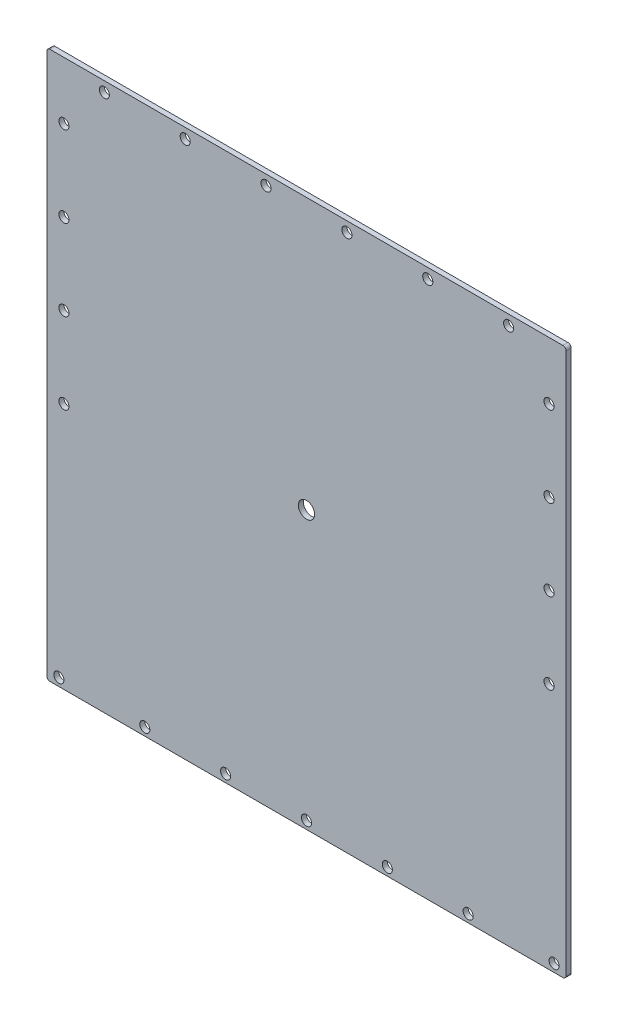
ISO-10303-21;
HEADER;
FILE_DESCRIPTION(('STEP AP214'),'2;1');
FILE_NAME('part.step','',(''),(''),'','','');
FILE_SCHEMA(('AUTOMOTIVE_DESIGN { 1 0 10303 214 1 1 1 1 }'));
ENDSEC;
DATA;
#1=APPLICATION_CONTEXT('core data for automotive mechanical design processes');
#2=APPLICATION_PROTOCOL_DEFINITION('international standard','automotive_design',2000,#1);
#3=PRODUCT_CONTEXT('',#1,'mechanical');
#4=PRODUCT('Part','Part','',(#3));
#5=PRODUCT_RELATED_PRODUCT_CATEGORY('part','',(#4));
#6=PRODUCT_DEFINITION_FORMATION('','',#4);
#7=PRODUCT_DEFINITION_CONTEXT('part definition',#1,'design');
#8=PRODUCT_DEFINITION('design','',#6,#7);
#9=PRODUCT_DEFINITION_SHAPE('','',#8);
#10=(LENGTH_UNIT() NAMED_UNIT(*) SI_UNIT(.MILLI.,.METRE.));
#11=(NAMED_UNIT(*) PLANE_ANGLE_UNIT() SI_UNIT($,.RADIAN.));
#12=(NAMED_UNIT(*) SI_UNIT($,.STERADIAN.) SOLID_ANGLE_UNIT());
#13=UNCERTAINTY_MEASURE_WITH_UNIT(LENGTH_MEASURE(1.E-05),#10,'distance_accuracy_value','');
#14=(GEOMETRIC_REPRESENTATION_CONTEXT(3) GLOBAL_UNCERTAINTY_ASSIGNED_CONTEXT((#13)) GLOBAL_UNIT_ASSIGNED_CONTEXT((#10,
#11,#12)) REPRESENTATION_CONTEXT('',''));
#15=CARTESIAN_POINT('',(0.,0.,0.));
#16=DIRECTION('',(0.,0.,1.));
#17=DIRECTION('',(1.,0.,0.));
#18=AXIS2_PLACEMENT_3D('',#15,#16,#17);
#19=CARTESIAN_POINT('',(0.,-171.98,1.5875));
#20=DIRECTION('',(0.,1.,0.));
#21=DIRECTION('',(-1.,0.,0.));
#22=AXIS2_PLACEMENT_3D('',#19,#20,#21);
#23=PLANE('',#22);
#24=DIRECTION('',(1.,0.,0.));
#25=VECTOR('',#24,1.);
#26=CARTESIAN_POINT('',(0.,-171.98,1.5875));
#27=LINE('',#26,#25);
#28=CARTESIAN_POINT('',(2.00000000000002,-171.98,1.5875));
#29=VERTEX_POINT('',#28);
#30=CARTESIAN_POINT('',(163.1,-171.98,1.5875));
#31=VERTEX_POINT('',#30);
#32=EDGE_CURVE('E123',#29,#31,#27,.T.);
#33=ORIENTED_EDGE('',*,*,#32,.F.);
#34=DIRECTION('',(0.,0.,-1.));
#35=VECTOR('',#34,1.);
#36=CARTESIAN_POINT('',(2.00000000000002,-171.98,1.5875));
#37=LINE('',#36,#35);
#38=CARTESIAN_POINT('',(2.00000000000002,-171.98,0.));
#39=VERTEX_POINT('',#38);
#40=EDGE_CURVE('E108',#29,#39,#37,.T.);
#41=ORIENTED_EDGE('',*,*,#40,.T.);
#42=DIRECTION('',(1.,0.,0.));
#43=VECTOR('',#42,1.);
#44=CARTESIAN_POINT('',(0.,-171.98,0.));
#45=LINE('',#44,#43);
#46=CARTESIAN_POINT('',(163.1,-171.98,0.));
#47=VERTEX_POINT('',#46);
#48=EDGE_CURVE('E120',#39,#47,#45,.T.);
#49=ORIENTED_EDGE('',*,*,#48,.T.);
#50=DIRECTION('',(0.,0.,-1.));
#51=VECTOR('',#50,1.);
#52=CARTESIAN_POINT('',(163.1,-171.98,1.5875));
#53=LINE('',#52,#51);
#54=EDGE_CURVE('E125',#47,#31,#53,.F.);
#55=ORIENTED_EDGE('',*,*,#54,.T.);
#56=EDGE_LOOP('',(#33,#41,#49,#55));
#57=FACE_BOUND('',#56,.T.);
#58=ADVANCED_FACE('F38',(#57),#23,.F.);
#59=CARTESIAN_POINT('',(164.1,0.,1.5875));
#60=DIRECTION('',(-1.,0.,0.));
#61=DIRECTION('',(0.,0.,1.));
#62=AXIS2_PLACEMENT_3D('',#59,#60,#61);
#63=PLANE('',#62);
#64=DIRECTION('',(0.,1.,0.));
#65=VECTOR('',#64,1.);
#66=CARTESIAN_POINT('',(164.1,0.,0.));
#67=LINE('',#66,#65);
#68=CARTESIAN_POINT('',(164.1,-170.98,0.));
#69=VERTEX_POINT('',#68);
#70=CARTESIAN_POINT('',(164.1,-0.99999999999998,0.));
#71=VERTEX_POINT('',#70);
#72=EDGE_CURVE('E130',#69,#71,#67,.T.);
#73=ORIENTED_EDGE('',*,*,#72,.T.);
#74=DIRECTION('',(0.,0.,-1.));
#75=VECTOR('',#74,1.);
#76=CARTESIAN_POINT('',(164.1,-0.99999999999998,1.5875));
#77=LINE('',#76,#75);
#78=CARTESIAN_POINT('',(164.1,-0.99999999999998,1.5875));
#79=VERTEX_POINT('',#78);
#80=EDGE_CURVE('E11',#71,#79,#77,.F.);
#81=ORIENTED_EDGE('',*,*,#80,.T.);
#82=DIRECTION('',(0.,1.,0.));
#83=VECTOR('',#82,1.);
#84=CARTESIAN_POINT('',(164.1,0.,1.5875));
#85=LINE('',#84,#83);
#86=CARTESIAN_POINT('',(164.1,-170.98,1.5875));
#87=VERTEX_POINT('',#86);
#88=EDGE_CURVE('E233',#87,#79,#85,.T.);
#89=ORIENTED_EDGE('',*,*,#88,.F.);
#90=DIRECTION('',(0.,0.,-1.));
#91=VECTOR('',#90,1.);
#92=CARTESIAN_POINT('',(164.1,-170.98,1.5875));
#93=LINE('',#92,#91);
#94=EDGE_CURVE('E46',#87,#69,#93,.T.);
#95=ORIENTED_EDGE('',*,*,#94,.T.);
#96=EDGE_LOOP('',(#73,#81,#89,#95));
#97=FACE_BOUND('',#96,.T.);
#98=ADVANCED_FACE('F231',(#97),#63,.F.);
#99=CARTESIAN_POINT('',(0.,0.,1.5875));
#100=DIRECTION('',(0.,1.,0.));
#101=DIRECTION('',(-1.,0.,0.));
#102=AXIS2_PLACEMENT_3D('',#99,#100,#101);
#103=PLANE('',#102);
#104=DIRECTION('',(1.,0.,0.));
#105=VECTOR('',#104,1.);
#106=CARTESIAN_POINT('',(0.,0.,0.));
#107=LINE('',#106,#105);
#108=CARTESIAN_POINT('',(2.,0.,0.));
#109=VERTEX_POINT('',#108);
#110=CARTESIAN_POINT('',(163.1,0.,0.));
#111=VERTEX_POINT('',#110);
#112=EDGE_CURVE('E134',#109,#111,#107,.T.);
#113=ORIENTED_EDGE('',*,*,#112,.F.);
#114=DIRECTION('',(0.,0.,-1.));
#115=VECTOR('',#114,1.);
#116=CARTESIAN_POINT('',(2.,0.,1.5875));
#117=LINE('',#116,#115);
#118=CARTESIAN_POINT('',(2.,0.,1.5875));
#119=VERTEX_POINT('',#118);
#120=EDGE_CURVE('E60',#109,#119,#117,.F.);
#121=ORIENTED_EDGE('',*,*,#120,.T.);
#122=DIRECTION('',(1.,0.,0.));
#123=VECTOR('',#122,1.);
#124=CARTESIAN_POINT('',(0.,0.,1.5875));
#125=LINE('',#124,#123);
#126=CARTESIAN_POINT('',(163.1,0.,1.5875));
#127=VERTEX_POINT('',#126);
#128=EDGE_CURVE('E240',#119,#127,#125,.T.);
#129=ORIENTED_EDGE('',*,*,#128,.T.);
#130=DIRECTION('',(0.,0.,-1.));
#131=VECTOR('',#130,1.);
#132=CARTESIAN_POINT('',(163.1,0.,0.));
#133=LINE('',#132,#131);
#134=EDGE_CURVE('E224',#127,#111,#133,.T.);
#135=ORIENTED_EDGE('',*,*,#134,.T.);
#136=EDGE_LOOP('',(#113,#121,#129,#135));
#137=FACE_BOUND('',#136,.T.);
#138=ADVANCED_FACE('F239',(#137),#103,.T.);
#139=CARTESIAN_POINT('',(158.75,-68.85,1.5875));
#140=DIRECTION('',(0.,0.,-1.));
#141=DIRECTION('',(-1.,0.,0.));
#142=AXIS2_PLACEMENT_3D('',#139,#140,#141);
#143=CYLINDRICAL_SURFACE('',#142,1.58749999999999);
#144=CARTESIAN_POINT('',(158.75,-68.85,1.5875));
#145=DIRECTION('',(0.,0.,1.));
#146=DIRECTION('',(1.,0.,0.));
#147=AXIS2_PLACEMENT_3D('',#144,#145,#146);
#148=CIRCLE('',#147,1.58749999999999);
#149=CARTESIAN_POINT('',(160.3375,-68.85,1.5875));
#150=VERTEX_POINT('',#149);
#151=EDGE_CURVE('E306',#150,#150,#148,.F.);
#152=ORIENTED_EDGE('',*,*,#151,.F.);
#153=EDGE_LOOP('',(#152));
#154=FACE_BOUND('',#153,.T.);
#155=CARTESIAN_POINT('',(158.75,-68.85,0.));
#156=DIRECTION('',(0.,0.,1.));
#157=DIRECTION('',(1.,0.,0.));
#158=AXIS2_PLACEMENT_3D('',#155,#156,#157);
#159=CIRCLE('',#158,1.58749999999999);
#160=CARTESIAN_POINT('',(160.3375,-68.85,0.));
#161=VERTEX_POINT('',#160);
#162=EDGE_CURVE('E201',#161,#161,#159,.F.);
#163=ORIENTED_EDGE('',*,*,#162,.T.);
#164=EDGE_LOOP('',(#163));
#165=FACE_BOUND('',#164,.T.);
#166=ADVANCED_FACE('F371',(#154,#165),#143,.F.);
#167=CARTESIAN_POINT('',(120.65,-3.17499999999999,1.5875));
#168=DIRECTION('',(0.,0.,-1.));
#169=DIRECTION('',(-1.,0.,0.));
#170=AXIS2_PLACEMENT_3D('',#167,#168,#169);
#171=CYLINDRICAL_SURFACE('',#170,1.5875);
#172=CARTESIAN_POINT('',(120.65,-3.17499999999999,1.5875));
#173=DIRECTION('',(0.,0.,1.));
#174=DIRECTION('',(1.,0.,0.));
#175=AXIS2_PLACEMENT_3D('',#172,#173,#174);
#176=CIRCLE('',#175,1.5875);
#177=CARTESIAN_POINT('',(122.2375,-3.17499999999999,1.5875));
#178=VERTEX_POINT('',#177);
#179=EDGE_CURVE('E303',#178,#178,#176,.F.);
#180=ORIENTED_EDGE('',*,*,#179,.F.);
#181=EDGE_LOOP('',(#180));
#182=FACE_BOUND('',#181,.T.);
#183=CARTESIAN_POINT('',(120.65,-3.17499999999999,0.));
#184=DIRECTION('',(0.,0.,1.));
#185=DIRECTION('',(1.,0.,0.));
#186=AXIS2_PLACEMENT_3D('',#183,#184,#185);
#187=CIRCLE('',#186,1.5875);
#188=CARTESIAN_POINT('',(122.2375,-3.17499999999999,0.));
#189=VERTEX_POINT('',#188);
#190=EDGE_CURVE('E198',#189,#189,#187,.F.);
#191=ORIENTED_EDGE('',*,*,#190,.T.);
#192=EDGE_LOOP('',(#191));
#193=FACE_BOUND('',#192,.T.);
#194=ADVANCED_FACE('F375',(#182,#193),#171,.F.);
#195=CARTESIAN_POINT('',(160.3375,-169.48,1.5875));
#196=DIRECTION('',(0.,0.,-1.));
#197=DIRECTION('',(-1.,0.,0.));
#198=AXIS2_PLACEMENT_3D('',#195,#196,#197);
#199=CYLINDRICAL_SURFACE('',#198,1.58749999999999);
#200=CARTESIAN_POINT('',(160.3375,-169.48,1.5875));
#201=DIRECTION('',(0.,0.,1.));
#202=DIRECTION('',(1.,0.,0.));
#203=AXIS2_PLACEMENT_3D('',#200,#201,#202);
#204=CIRCLE('',#203,1.58749999999999);
#205=CARTESIAN_POINT('',(161.925,-169.48,1.5875));
#206=VERTEX_POINT('',#205);
#207=EDGE_CURVE('E300',#206,#206,#204,.T.);
#208=ORIENTED_EDGE('',*,*,#207,.T.);
#209=EDGE_LOOP('',(#208));
#210=FACE_BOUND('',#209,.T.);
#211=CARTESIAN_POINT('',(160.3375,-169.48,0.));
#212=DIRECTION('',(0.,0.,1.));
#213=DIRECTION('',(1.,0.,0.));
#214=AXIS2_PLACEMENT_3D('',#211,#212,#213);
#215=CIRCLE('',#214,1.58749999999999);
#216=CARTESIAN_POINT('',(161.925,-169.48,0.));
#217=VERTEX_POINT('',#216);
#218=EDGE_CURVE('E195',#217,#217,#215,.T.);
#219=ORIENTED_EDGE('',*,*,#218,.F.);
#220=EDGE_LOOP('',(#219));
#221=FACE_BOUND('',#220,.T.);
#222=ADVANCED_FACE('F381',(#210,#221),#199,.F.);
#223=CARTESIAN_POINT('',(133.35,-169.48,1.5875));
#224=DIRECTION('',(0.,0.,-1.));
#225=DIRECTION('',(-1.,0.,0.));
#226=AXIS2_PLACEMENT_3D('',#223,#224,#225);
#227=CYLINDRICAL_SURFACE('',#226,1.58749999999999);
#228=CARTESIAN_POINT('',(133.35,-169.48,1.5875));
#229=DIRECTION('',(0.,0.,1.));
#230=DIRECTION('',(1.,0.,0.));
#231=AXIS2_PLACEMENT_3D('',#228,#229,#230);
#232=CIRCLE('',#231,1.58749999999999);
#233=CARTESIAN_POINT('',(134.9375,-169.48,1.5875));
#234=VERTEX_POINT('',#233);
#235=EDGE_CURVE('E297',#234,#234,#232,.T.);
#236=ORIENTED_EDGE('',*,*,#235,.T.);
#237=EDGE_LOOP('',(#236));
#238=FACE_BOUND('',#237,.T.);
#239=CARTESIAN_POINT('',(133.35,-169.48,0.));
#240=DIRECTION('',(0.,0.,1.));
#241=DIRECTION('',(1.,0.,0.));
#242=AXIS2_PLACEMENT_3D('',#239,#240,#241);
#243=CIRCLE('',#242,1.58749999999999);
#244=CARTESIAN_POINT('',(134.9375,-169.48,0.));
#245=VERTEX_POINT('',#244);
#246=EDGE_CURVE('E192',#245,#245,#243,.T.);
#247=ORIENTED_EDGE('',*,*,#246,.F.);
#248=EDGE_LOOP('',(#247));
#249=FACE_BOUND('',#248,.T.);
#250=ADVANCED_FACE('F389',(#238,#249),#227,.F.);
#251=CARTESIAN_POINT('',(107.95,-169.48,1.5875));
#252=DIRECTION('',(0.,0.,-1.));
#253=DIRECTION('',(-1.,0.,0.));
#254=AXIS2_PLACEMENT_3D('',#251,#252,#253);
#255=CYLINDRICAL_SURFACE('',#254,1.58749999999999);
#256=CARTESIAN_POINT('',(107.95,-169.48,1.5875));
#257=DIRECTION('',(0.,0.,1.));
#258=DIRECTION('',(1.,0.,0.));
#259=AXIS2_PLACEMENT_3D('',#256,#257,#258);
#260=CIRCLE('',#259,1.58749999999999);
#261=CARTESIAN_POINT('',(109.5375,-169.48,1.5875));
#262=VERTEX_POINT('',#261);
#263=EDGE_CURVE('E294',#262,#262,#260,.T.);
#264=ORIENTED_EDGE('',*,*,#263,.T.);
#265=EDGE_LOOP('',(#264));
#266=FACE_BOUND('',#265,.T.);
#267=CARTESIAN_POINT('',(107.95,-169.48,0.));
#268=DIRECTION('',(0.,0.,1.));
#269=DIRECTION('',(1.,0.,0.));
#270=AXIS2_PLACEMENT_3D('',#267,#268,#269);
#271=CIRCLE('',#270,1.58749999999999);
#272=CARTESIAN_POINT('',(109.5375,-169.48,0.));
#273=VERTEX_POINT('',#272);
#274=EDGE_CURVE('E189',#273,#273,#271,.T.);
#275=ORIENTED_EDGE('',*,*,#274,.F.);
#276=EDGE_LOOP('',(#275));
#277=FACE_BOUND('',#276,.T.);
#278=ADVANCED_FACE('F393',(#266,#277),#255,.F.);
#279=CARTESIAN_POINT('',(95.25,-3.175,1.5875));
#280=DIRECTION('',(0.,0.,-1.));
#281=DIRECTION('',(-1.,0.,0.));
#282=AXIS2_PLACEMENT_3D('',#279,#280,#281);
#283=CYLINDRICAL_SURFACE('',#282,1.5875);
#284=CARTESIAN_POINT('',(95.25,-3.175,1.5875));
#285=DIRECTION('',(0.,0.,1.));
#286=DIRECTION('',(1.,0.,0.));
#287=AXIS2_PLACEMENT_3D('',#284,#285,#286);
#288=CIRCLE('',#287,1.5875);
#289=CARTESIAN_POINT('',(96.8375,-3.175,1.5875));
#290=VERTEX_POINT('',#289);
#291=EDGE_CURVE('E291',#290,#290,#288,.F.);
#292=ORIENTED_EDGE('',*,*,#291,.F.);
#293=EDGE_LOOP('',(#292));
#294=FACE_BOUND('',#293,.T.);
#295=CARTESIAN_POINT('',(95.25,-3.175,0.));
#296=DIRECTION('',(0.,0.,1.));
#297=DIRECTION('',(1.,0.,0.));
#298=AXIS2_PLACEMENT_3D('',#295,#296,#297);
#299=CIRCLE('',#298,1.5875);
#300=CARTESIAN_POINT('',(96.8375,-3.175,0.));
#301=VERTEX_POINT('',#300);
#302=EDGE_CURVE('E186',#301,#301,#299,.F.);
#303=ORIENTED_EDGE('',*,*,#302,.T.);
#304=EDGE_LOOP('',(#303));
#305=FACE_BOUND('',#304,.T.);
#306=ADVANCED_FACE('F397',(#294,#305),#283,.F.);
#307=CARTESIAN_POINT('',(146.05,-3.17499999999998,1.5875));
#308=DIRECTION('',(0.,0.,-1.));
#309=DIRECTION('',(-1.,0.,0.));
#310=AXIS2_PLACEMENT_3D('',#307,#308,#309);
#311=CYLINDRICAL_SURFACE('',#310,1.58749999999999);
#312=CARTESIAN_POINT('',(146.05,-3.17499999999998,1.5875));
#313=DIRECTION('',(0.,0.,1.));
#314=DIRECTION('',(1.,0.,0.));
#315=AXIS2_PLACEMENT_3D('',#312,#313,#314);
#316=CIRCLE('',#315,1.58749999999999);
#317=CARTESIAN_POINT('',(147.6375,-3.17499999999998,1.5875));
#318=VERTEX_POINT('',#317);
#319=EDGE_CURVE('E288',#318,#318,#316,.F.);
#320=ORIENTED_EDGE('',*,*,#319,.F.);
#321=EDGE_LOOP('',(#320));
#322=FACE_BOUND('',#321,.T.);
#323=CARTESIAN_POINT('',(146.05,-3.17499999999998,0.));
#324=DIRECTION('',(0.,0.,1.));
#325=DIRECTION('',(1.,0.,0.));
#326=AXIS2_PLACEMENT_3D('',#323,#324,#325);
#327=CIRCLE('',#326,1.58749999999999);
#328=CARTESIAN_POINT('',(147.6375,-3.17499999999998,0.));
#329=VERTEX_POINT('',#328);
#330=EDGE_CURVE('E183',#329,#329,#327,.F.);
#331=ORIENTED_EDGE('',*,*,#330,.T.);
#332=EDGE_LOOP('',(#331));
#333=FACE_BOUND('',#332,.T.);
#334=ADVANCED_FACE('F401',(#322,#333),#311,.F.);
#335=CARTESIAN_POINT('',(158.75,-94.25,1.5875));
#336=DIRECTION('',(0.,0.,-1.));
#337=DIRECTION('',(-1.,0.,0.));
#338=AXIS2_PLACEMENT_3D('',#335,#336,#337);
#339=CYLINDRICAL_SURFACE('',#338,1.58749999999999);
#340=CARTESIAN_POINT('',(158.75,-94.25,1.5875));
#341=DIRECTION('',(0.,0.,1.));
#342=DIRECTION('',(1.,0.,0.));
#343=AXIS2_PLACEMENT_3D('',#340,#341,#342);
#344=CIRCLE('',#343,1.58749999999999);
#345=CARTESIAN_POINT('',(160.3375,-94.25,1.5875));
#346=VERTEX_POINT('',#345);
#347=EDGE_CURVE('E285',#346,#346,#344,.F.);
#348=ORIENTED_EDGE('',*,*,#347,.F.);
#349=EDGE_LOOP('',(#348));
#350=FACE_BOUND('',#349,.T.);
#351=CARTESIAN_POINT('',(158.75,-94.25,0.));
#352=DIRECTION('',(0.,0.,1.));
#353=DIRECTION('',(1.,0.,0.));
#354=AXIS2_PLACEMENT_3D('',#351,#352,#353);
#355=CIRCLE('',#354,1.58749999999999);
#356=CARTESIAN_POINT('',(160.3375,-94.25,0.));
#357=VERTEX_POINT('',#356);
#358=EDGE_CURVE('E180',#357,#357,#355,.F.);
#359=ORIENTED_EDGE('',*,*,#358,.T.);
#360=EDGE_LOOP('',(#359));
#361=FACE_BOUND('',#360,.T.);
#362=ADVANCED_FACE('F405',(#350,#361),#339,.F.);
#363=CARTESIAN_POINT('',(158.750000000001,-18.05,1.5875));
#364=DIRECTION('',(0.,0.,-1.));
#365=DIRECTION('',(-1.,0.,0.));
#366=AXIS2_PLACEMENT_3D('',#363,#364,#365);
#367=CYLINDRICAL_SURFACE('',#366,1.58749999999999);
#368=CARTESIAN_POINT('',(158.750000000001,-18.05,1.5875));
#369=DIRECTION('',(0.,0.,1.));
#370=DIRECTION('',(1.,0.,0.));
#371=AXIS2_PLACEMENT_3D('',#368,#369,#370);
#372=CIRCLE('',#371,1.58749999999999);
#373=CARTESIAN_POINT('',(160.3375,-18.05,1.5875));
#374=VERTEX_POINT('',#373);
#375=EDGE_CURVE('E282',#374,#374,#372,.F.);
#376=ORIENTED_EDGE('',*,*,#375,.F.);
#377=EDGE_LOOP('',(#376));
#378=FACE_BOUND('',#377,.T.);
#379=CARTESIAN_POINT('',(158.750000000001,-18.05,0.));
#380=DIRECTION('',(0.,0.,1.));
#381=DIRECTION('',(1.,0.,0.));
#382=AXIS2_PLACEMENT_3D('',#379,#380,#381);
#383=CIRCLE('',#382,1.58749999999999);
#384=CARTESIAN_POINT('',(160.3375,-18.05,0.));
#385=VERTEX_POINT('',#384);
#386=EDGE_CURVE('E177',#385,#385,#383,.F.);
#387=ORIENTED_EDGE('',*,*,#386,.T.);
#388=EDGE_LOOP('',(#387));
#389=FACE_BOUND('',#388,.T.);
#390=ADVANCED_FACE('F409',(#378,#389),#367,.F.);
#391=CARTESIAN_POINT('',(69.85,-3.175,1.5875));
#392=DIRECTION('',(0.,0.,-1.));
#393=DIRECTION('',(-1.,0.,0.));
#394=AXIS2_PLACEMENT_3D('',#391,#392,#393);
#395=CYLINDRICAL_SURFACE('',#394,1.5875);
#396=CARTESIAN_POINT('',(69.85,-3.175,1.5875));
#397=DIRECTION('',(0.,0.,1.));
#398=DIRECTION('',(1.,0.,0.));
#399=AXIS2_PLACEMENT_3D('',#396,#397,#398);
#400=CIRCLE('',#399,1.5875);
#401=CARTESIAN_POINT('',(71.4375,-3.175,1.5875));
#402=VERTEX_POINT('',#401);
#403=EDGE_CURVE('E279',#402,#402,#400,.T.);
#404=ORIENTED_EDGE('',*,*,#403,.T.);
#405=EDGE_LOOP('',(#404));
#406=FACE_BOUND('',#405,.T.);
#407=CARTESIAN_POINT('',(69.85,-3.175,0.));
#408=DIRECTION('',(0.,0.,1.));
#409=DIRECTION('',(1.,0.,0.));
#410=AXIS2_PLACEMENT_3D('',#407,#408,#409);
#411=CIRCLE('',#410,1.5875);
#412=CARTESIAN_POINT('',(71.4375,-3.175,0.));
#413=VERTEX_POINT('',#412);
#414=EDGE_CURVE('E174',#413,#413,#411,.T.);
#415=ORIENTED_EDGE('',*,*,#414,.F.);
#416=EDGE_LOOP('',(#415));
#417=FACE_BOUND('',#416,.T.);
#418=ADVANCED_FACE('F413',(#406,#417),#395,.F.);
#419=CARTESIAN_POINT('',(44.45,-3.175,1.5875));
#420=DIRECTION('',(0.,0.,-1.));
#421=DIRECTION('',(-1.,0.,0.));
#422=AXIS2_PLACEMENT_3D('',#419,#420,#421);
#423=CYLINDRICAL_SURFACE('',#422,1.5875);
#424=CARTESIAN_POINT('',(44.45,-3.175,1.5875));
#425=DIRECTION('',(0.,0.,1.));
#426=DIRECTION('',(1.,0.,0.));
#427=AXIS2_PLACEMENT_3D('',#424,#425,#426);
#428=CIRCLE('',#427,1.5875);
#429=CARTESIAN_POINT('',(46.0375,-3.175,1.5875));
#430=VERTEX_POINT('',#429);
#431=EDGE_CURVE('E276',#430,#430,#428,.T.);
#432=ORIENTED_EDGE('',*,*,#431,.T.);
#433=EDGE_LOOP('',(#432));
#434=FACE_BOUND('',#433,.T.);
#435=CARTESIAN_POINT('',(44.45,-3.175,0.));
#436=DIRECTION('',(0.,0.,1.));
#437=DIRECTION('',(1.,0.,0.));
#438=AXIS2_PLACEMENT_3D('',#435,#436,#437);
#439=CIRCLE('',#438,1.5875);
#440=CARTESIAN_POINT('',(46.0375,-3.175,0.));
#441=VERTEX_POINT('',#440);
#442=EDGE_CURVE('E171',#441,#441,#439,.T.);
#443=ORIENTED_EDGE('',*,*,#442,.F.);
#444=EDGE_LOOP('',(#443));
#445=FACE_BOUND('',#444,.T.);
#446=ADVANCED_FACE('F417',(#434,#445),#423,.F.);
#447=CARTESIAN_POINT('',(19.05,-3.175,1.5875));
#448=DIRECTION('',(0.,0.,-1.));
#449=DIRECTION('',(-1.,0.,0.));
#450=AXIS2_PLACEMENT_3D('',#447,#448,#449);
#451=CYLINDRICAL_SURFACE('',#450,1.5875);
#452=CARTESIAN_POINT('',(19.05,-3.175,1.5875));
#453=DIRECTION('',(0.,0.,1.));
#454=DIRECTION('',(1.,0.,0.));
#455=AXIS2_PLACEMENT_3D('',#452,#453,#454);
#456=CIRCLE('',#455,1.5875);
#457=CARTESIAN_POINT('',(20.6375,-3.175,1.5875));
#458=VERTEX_POINT('',#457);
#459=EDGE_CURVE('E273',#458,#458,#456,.T.);
#460=ORIENTED_EDGE('',*,*,#459,.T.);
#461=EDGE_LOOP('',(#460));
#462=FACE_BOUND('',#461,.T.);
#463=CARTESIAN_POINT('',(19.05,-3.175,0.));
#464=DIRECTION('',(0.,0.,1.));
#465=DIRECTION('',(1.,0.,0.));
#466=AXIS2_PLACEMENT_3D('',#463,#464,#465);
#467=CIRCLE('',#466,1.5875);
#468=CARTESIAN_POINT('',(20.6375,-3.175,0.));
#469=VERTEX_POINT('',#468);
#470=EDGE_CURVE('E168',#469,#469,#467,.T.);
#471=ORIENTED_EDGE('',*,*,#470,.F.);
#472=EDGE_LOOP('',(#471));
#473=FACE_BOUND('',#472,.T.);
#474=ADVANCED_FACE('F421',(#462,#473),#451,.F.);
#475=CARTESIAN_POINT('',(31.75,-169.48,1.5875));
#476=DIRECTION('',(0.,0.,-1.));
#477=DIRECTION('',(-1.,0.,0.));
#478=AXIS2_PLACEMENT_3D('',#475,#476,#477);
#479=CYLINDRICAL_SURFACE('',#478,1.5875);
#480=CARTESIAN_POINT('',(31.75,-169.48,1.5875));
#481=DIRECTION('',(0.,0.,1.));
#482=DIRECTION('',(1.,0.,0.));
#483=AXIS2_PLACEMENT_3D('',#480,#481,#482);
#484=CIRCLE('',#483,1.5875);
#485=CARTESIAN_POINT('',(33.3375,-169.48,1.5875));
#486=VERTEX_POINT('',#485);
#487=EDGE_CURVE('E270',#486,#486,#484,.T.);
#488=ORIENTED_EDGE('',*,*,#487,.T.);
#489=EDGE_LOOP('',(#488));
#490=FACE_BOUND('',#489,.T.);
#491=CARTESIAN_POINT('',(31.75,-169.48,0.));
#492=DIRECTION('',(0.,0.,1.));
#493=DIRECTION('',(1.,0.,0.));
#494=AXIS2_PLACEMENT_3D('',#491,#492,#493);
#495=CIRCLE('',#494,1.5875);
#496=CARTESIAN_POINT('',(33.3375,-169.48,0.));
#497=VERTEX_POINT('',#496);
#498=EDGE_CURVE('E165',#497,#497,#495,.T.);
#499=ORIENTED_EDGE('',*,*,#498,.F.);
#500=EDGE_LOOP('',(#499));
#501=FACE_BOUND('',#500,.T.);
#502=ADVANCED_FACE('F425',(#490,#501),#479,.F.);
#503=CARTESIAN_POINT('',(57.15,-169.48,1.5875));
#504=DIRECTION('',(0.,0.,-1.));
#505=DIRECTION('',(-1.,0.,0.));
#506=AXIS2_PLACEMENT_3D('',#503,#504,#505);
#507=CYLINDRICAL_SURFACE('',#506,1.5875);
#508=CARTESIAN_POINT('',(57.15,-169.48,1.5875));
#509=DIRECTION('',(0.,0.,1.));
#510=DIRECTION('',(1.,0.,0.));
#511=AXIS2_PLACEMENT_3D('',#508,#509,#510);
#512=CIRCLE('',#511,1.5875);
#513=CARTESIAN_POINT('',(58.7375,-169.48,1.5875));
#514=VERTEX_POINT('',#513);
#515=EDGE_CURVE('E267',#514,#514,#512,.T.);
#516=ORIENTED_EDGE('',*,*,#515,.T.);
#517=EDGE_LOOP('',(#516));
#518=FACE_BOUND('',#517,.T.);
#519=CARTESIAN_POINT('',(57.15,-169.48,0.));
#520=DIRECTION('',(0.,0.,1.));
#521=DIRECTION('',(1.,0.,0.));
#522=AXIS2_PLACEMENT_3D('',#519,#520,#521);
#523=CIRCLE('',#522,1.5875);
#524=CARTESIAN_POINT('',(58.7375,-169.48,0.));
#525=VERTEX_POINT('',#524);
#526=EDGE_CURVE('E162',#525,#525,#523,.T.);
#527=ORIENTED_EDGE('',*,*,#526,.F.);
#528=EDGE_LOOP('',(#527));
#529=FACE_BOUND('',#528,.T.);
#530=ADVANCED_FACE('F429',(#518,#529),#507,.F.);
#531=CARTESIAN_POINT('',(6.34999999999949,-18.05,1.5875));
#532=DIRECTION('',(0.,0.,-1.));
#533=DIRECTION('',(-1.,0.,0.));
#534=AXIS2_PLACEMENT_3D('',#531,#532,#533);
#535=CYLINDRICAL_SURFACE('',#534,1.5875);
#536=CARTESIAN_POINT('',(6.34999999999949,-18.05,1.5875));
#537=DIRECTION('',(0.,0.,1.));
#538=DIRECTION('',(1.,0.,0.));
#539=AXIS2_PLACEMENT_3D('',#536,#537,#538);
#540=CIRCLE('',#539,1.5875);
#541=CARTESIAN_POINT('',(7.93749999999949,-18.05,1.5875));
#542=VERTEX_POINT('',#541);
#543=EDGE_CURVE('E264',#542,#542,#540,.T.);
#544=ORIENTED_EDGE('',*,*,#543,.T.);
#545=EDGE_LOOP('',(#544));
#546=FACE_BOUND('',#545,.T.);
#547=CARTESIAN_POINT('',(6.34999999999949,-18.05,0.));
#548=DIRECTION('',(0.,0.,1.));
#549=DIRECTION('',(1.,0.,0.));
#550=AXIS2_PLACEMENT_3D('',#547,#548,#549);
#551=CIRCLE('',#550,1.5875);
#552=CARTESIAN_POINT('',(7.93749999999949,-18.05,0.));
#553=VERTEX_POINT('',#552);
#554=EDGE_CURVE('E159',#553,#553,#551,.T.);
#555=ORIENTED_EDGE('',*,*,#554,.F.);
#556=EDGE_LOOP('',(#555));
#557=FACE_BOUND('',#556,.T.);
#558=ADVANCED_FACE('F433',(#546,#557),#535,.F.);
#559=CARTESIAN_POINT('',(4.7625,-169.48,1.5875));
#560=DIRECTION('',(0.,0.,-1.));
#561=DIRECTION('',(-1.,0.,0.));
#562=AXIS2_PLACEMENT_3D('',#559,#560,#561);
#563=CYLINDRICAL_SURFACE('',#562,1.5875);
#564=CARTESIAN_POINT('',(4.7625,-169.48,1.5875));
#565=DIRECTION('',(0.,0.,1.));
#566=DIRECTION('',(1.,0.,0.));
#567=AXIS2_PLACEMENT_3D('',#564,#565,#566);
#568=CIRCLE('',#567,1.5875);
#569=CARTESIAN_POINT('',(6.35,-169.48,1.5875));
#570=VERTEX_POINT('',#569);
#571=EDGE_CURVE('E261',#570,#570,#568,.F.);
#572=ORIENTED_EDGE('',*,*,#571,.F.);
#573=EDGE_LOOP('',(#572));
#574=FACE_BOUND('',#573,.T.);
#575=CARTESIAN_POINT('',(4.7625,-169.48,0.));
#576=DIRECTION('',(0.,0.,1.));
#577=DIRECTION('',(1.,0.,0.));
#578=AXIS2_PLACEMENT_3D('',#575,#576,#577);
#579=CIRCLE('',#578,1.5875);
#580=CARTESIAN_POINT('',(6.35,-169.48,0.));
#581=VERTEX_POINT('',#580);
#582=EDGE_CURVE('E156',#581,#581,#579,.F.);
#583=ORIENTED_EDGE('',*,*,#582,.T.);
#584=EDGE_LOOP('',(#583));
#585=FACE_BOUND('',#584,.T.);
#586=ADVANCED_FACE('F437',(#574,#585),#563,.F.);
#587=CARTESIAN_POINT('',(6.34999999999976,-43.45,1.5875));
#588=DIRECTION('',(0.,0.,-1.));
#589=DIRECTION('',(-1.,0.,0.));
#590=AXIS2_PLACEMENT_3D('',#587,#588,#589);
#591=CYLINDRICAL_SURFACE('',#590,1.5875);
#592=CARTESIAN_POINT('',(6.34999999999976,-43.45,1.5875));
#593=DIRECTION('',(0.,0.,1.));
#594=DIRECTION('',(1.,0.,0.));
#595=AXIS2_PLACEMENT_3D('',#592,#593,#594);
#596=CIRCLE('',#595,1.5875);
#597=CARTESIAN_POINT('',(7.93749999999976,-43.45,1.5875));
#598=VERTEX_POINT('',#597);
#599=EDGE_CURVE('E258',#598,#598,#596,.T.);
#600=ORIENTED_EDGE('',*,*,#599,.T.);
#601=EDGE_LOOP('',(#600));
#602=FACE_BOUND('',#601,.T.);
#603=CARTESIAN_POINT('',(6.34999999999976,-43.45,0.));
#604=DIRECTION('',(0.,0.,1.));
#605=DIRECTION('',(1.,0.,0.));
#606=AXIS2_PLACEMENT_3D('',#603,#604,#605);
#607=CIRCLE('',#606,1.5875);
#608=CARTESIAN_POINT('',(7.93749999999976,-43.45,0.));
#609=VERTEX_POINT('',#608);
#610=EDGE_CURVE('E153',#609,#609,#607,.T.);
#611=ORIENTED_EDGE('',*,*,#610,.F.);
#612=EDGE_LOOP('',(#611));
#613=FACE_BOUND('',#612,.T.);
#614=ADVANCED_FACE('F441',(#602,#613),#591,.F.);
#615=CARTESIAN_POINT('',(6.35000000000002,-68.85,1.5875));
#616=DIRECTION('',(0.,0.,-1.));
#617=DIRECTION('',(-1.,0.,0.));
#618=AXIS2_PLACEMENT_3D('',#615,#616,#617);
#619=CYLINDRICAL_SURFACE('',#618,1.5875);
#620=CARTESIAN_POINT('',(6.35000000000002,-68.85,1.5875));
#621=DIRECTION('',(0.,0.,1.));
#622=DIRECTION('',(1.,0.,0.));
#623=AXIS2_PLACEMENT_3D('',#620,#621,#622);
#624=CIRCLE('',#623,1.5875);
#625=CARTESIAN_POINT('',(7.93750000000002,-68.85,1.5875));
#626=VERTEX_POINT('',#625);
#627=EDGE_CURVE('E255',#626,#626,#624,.T.);
#628=ORIENTED_EDGE('',*,*,#627,.T.);
#629=EDGE_LOOP('',(#628));
#630=FACE_BOUND('',#629,.T.);
#631=CARTESIAN_POINT('',(6.35000000000002,-68.85,0.));
#632=DIRECTION('',(0.,0.,1.));
#633=DIRECTION('',(1.,0.,0.));
#634=AXIS2_PLACEMENT_3D('',#631,#632,#633);
#635=CIRCLE('',#634,1.5875);
#636=CARTESIAN_POINT('',(7.93750000000002,-68.85,0.));
#637=VERTEX_POINT('',#636);
#638=EDGE_CURVE('E150',#637,#637,#635,.T.);
#639=ORIENTED_EDGE('',*,*,#638,.F.);
#640=EDGE_LOOP('',(#639));
#641=FACE_BOUND('',#640,.T.);
#642=ADVANCED_FACE('F445',(#630,#641),#619,.F.);
#643=CARTESIAN_POINT('',(6.35000000000029,-94.25,1.5875));
#644=DIRECTION('',(0.,0.,-1.));
#645=DIRECTION('',(-1.,0.,0.));
#646=AXIS2_PLACEMENT_3D('',#643,#644,#645);
#647=CYLINDRICAL_SURFACE('',#646,1.5875);
#648=CARTESIAN_POINT('',(6.35000000000029,-94.25,1.5875));
#649=DIRECTION('',(0.,0.,1.));
#650=DIRECTION('',(1.,0.,0.));
#651=AXIS2_PLACEMENT_3D('',#648,#649,#650);
#652=CIRCLE('',#651,1.5875);
#653=CARTESIAN_POINT('',(7.93750000000029,-94.25,1.5875));
#654=VERTEX_POINT('',#653);
#655=EDGE_CURVE('E252',#654,#654,#652,.T.);
#656=ORIENTED_EDGE('',*,*,#655,.T.);
#657=EDGE_LOOP('',(#656));
#658=FACE_BOUND('',#657,.T.);
#659=CARTESIAN_POINT('',(6.35000000000029,-94.25,0.));
#660=DIRECTION('',(0.,0.,1.));
#661=DIRECTION('',(1.,0.,0.));
#662=AXIS2_PLACEMENT_3D('',#659,#660,#661);
#663=CIRCLE('',#662,1.5875);
#664=CARTESIAN_POINT('',(7.93750000000029,-94.25,0.));
#665=VERTEX_POINT('',#664);
#666=EDGE_CURVE('E147',#665,#665,#663,.T.);
#667=ORIENTED_EDGE('',*,*,#666,.F.);
#668=EDGE_LOOP('',(#667));
#669=FACE_BOUND('',#668,.T.);
#670=ADVANCED_FACE('F366',(#658,#669),#647,.F.);
#671=CARTESIAN_POINT('',(82.55,-169.48,1.5875));
#672=DIRECTION('',(0.,0.,-1.));
#673=DIRECTION('',(-1.,0.,0.));
#674=AXIS2_PLACEMENT_3D('',#671,#672,#673);
#675=CYLINDRICAL_SURFACE('',#674,1.5875);
#676=CARTESIAN_POINT('',(82.55,-169.48,1.5875));
#677=DIRECTION('',(0.,0.,1.));
#678=DIRECTION('',(1.,0.,0.));
#679=AXIS2_PLACEMENT_3D('',#676,#677,#678);
#680=CIRCLE('',#679,1.5875);
#681=CARTESIAN_POINT('',(84.1375,-169.48,1.5875));
#682=VERTEX_POINT('',#681);
#683=EDGE_CURVE('E245',#682,#682,#680,.T.);
#684=ORIENTED_EDGE('',*,*,#683,.T.);
#685=EDGE_LOOP('',(#684));
#686=FACE_BOUND('',#685,.T.);
#687=CARTESIAN_POINT('',(82.55,-169.48,0.));
#688=DIRECTION('',(0.,0.,1.));
#689=DIRECTION('',(1.,0.,0.));
#690=AXIS2_PLACEMENT_3D('',#687,#688,#689);
#691=CIRCLE('',#690,1.5875);
#692=CARTESIAN_POINT('',(84.1375,-169.48,0.));
#693=VERTEX_POINT('',#692);
#694=EDGE_CURVE('E144',#693,#693,#691,.T.);
#695=ORIENTED_EDGE('',*,*,#694,.F.);
#696=EDGE_LOOP('',(#695));
#697=FACE_BOUND('',#696,.T.);
#698=ADVANCED_FACE('F361',(#686,#697),#675,.F.);
#699=CARTESIAN_POINT('',(1.,0.,1.5875));
#700=DIRECTION('',(1.,0.,0.));
#701=DIRECTION('',(0.,1.,0.));
#702=AXIS2_PLACEMENT_3D('',#699,#700,#701);
#703=PLANE('',#702);
#704=DIRECTION('',(0.,-1.,0.));
#705=VECTOR('',#704,1.);
#706=CARTESIAN_POINT('',(1.,0.,0.));
#707=LINE('',#706,#705);
#708=CARTESIAN_POINT('',(1.,-1.,0.));
#709=VERTEX_POINT('',#708);
#710=CARTESIAN_POINT('',(1.00000000000002,-170.98,0.));
#711=VERTEX_POINT('',#710);
#712=EDGE_CURVE('E142',#709,#711,#707,.T.);
#713=ORIENTED_EDGE('',*,*,#712,.T.);
#714=DIRECTION('',(0.,0.,-1.));
#715=VECTOR('',#714,1.);
#716=CARTESIAN_POINT('',(1.00000000000002,-170.98,1.5875));
#717=LINE('',#716,#715);
#718=CARTESIAN_POINT('',(1.00000000000002,-170.98,1.5875));
#719=VERTEX_POINT('',#718);
#720=EDGE_CURVE('E109',#711,#719,#717,.F.);
#721=ORIENTED_EDGE('',*,*,#720,.T.);
#722=DIRECTION('',(0.,-1.,0.));
#723=VECTOR('',#722,1.);
#724=CARTESIAN_POINT('',(1.,0.,1.5875));
#725=LINE('',#724,#723);
#726=CARTESIAN_POINT('',(1.,-1.,1.5875));
#727=VERTEX_POINT('',#726);
#728=EDGE_CURVE('E242',#727,#719,#725,.T.);
#729=ORIENTED_EDGE('',*,*,#728,.F.);
#730=DIRECTION('',(0.,0.,-1.));
#731=VECTOR('',#730,1.);
#732=CARTESIAN_POINT('',(1.,-1.,0.));
#733=LINE('',#732,#731);
#734=EDGE_CURVE('E114',#727,#709,#733,.T.);
#735=ORIENTED_EDGE('',*,*,#734,.T.);
#736=EDGE_LOOP('',(#713,#721,#729,#735));
#737=FACE_BOUND('',#736,.T.);
#738=ADVANCED_FACE('F340',(#737),#703,.F.);
#739=CARTESIAN_POINT('',(82.55,-85.,1.5875));
#740=DIRECTION('',(0.,0.,-1.));
#741=DIRECTION('',(-1.,0.,0.));
#742=AXIS2_PLACEMENT_3D('',#739,#740,#741);
#743=CYLINDRICAL_SURFACE('',#742,2.55270000000003);
#744=CARTESIAN_POINT('',(82.55,-85.,1.5875));
#745=DIRECTION('',(0.,0.,1.));
#746=DIRECTION('',(1.,0.,0.));
#747=AXIS2_PLACEMENT_3D('',#744,#745,#746);
#748=CIRCLE('',#747,2.55270000000003);
#749=CARTESIAN_POINT('',(85.1027,-85.,1.5875));
#750=VERTEX_POINT('',#749);
#751=EDGE_CURVE('E207',#750,#750,#748,.T.);
#752=ORIENTED_EDGE('',*,*,#751,.T.);
#753=EDGE_LOOP('',(#752));
#754=FACE_BOUND('',#753,.T.);
#755=CARTESIAN_POINT('',(82.55,-85.,0.));
#756=DIRECTION('',(0.,0.,1.));
#757=DIRECTION('',(1.,0.,0.));
#758=AXIS2_PLACEMENT_3D('',#755,#756,#757);
#759=CIRCLE('',#758,2.55270000000003);
#760=CARTESIAN_POINT('',(85.1027,-85.,0.));
#761=VERTEX_POINT('',#760);
#762=EDGE_CURVE('E131',#761,#761,#759,.T.);
#763=ORIENTED_EDGE('',*,*,#762,.F.);
#764=EDGE_LOOP('',(#763));
#765=FACE_BOUND('',#764,.T.);
#766=ADVANCED_FACE('F316',(#754,#765),#743,.F.);
#767=CARTESIAN_POINT('',(158.75,-43.45,1.5875));
#768=DIRECTION('',(0.,0.,-1.));
#769=DIRECTION('',(-1.,0.,0.));
#770=AXIS2_PLACEMENT_3D('',#767,#768,#769);
#771=CYLINDRICAL_SURFACE('',#770,1.58749999999999);
#772=CARTESIAN_POINT('',(158.75,-43.45,1.5875));
#773=DIRECTION('',(0.,0.,1.));
#774=DIRECTION('',(1.,0.,0.));
#775=AXIS2_PLACEMENT_3D('',#772,#773,#774);
#776=CIRCLE('',#775,1.58749999999999);
#777=CARTESIAN_POINT('',(160.3375,-43.45,1.5875));
#778=VERTEX_POINT('',#777);
#779=EDGE_CURVE('E208',#778,#778,#776,.F.);
#780=ORIENTED_EDGE('',*,*,#779,.F.);
#781=EDGE_LOOP('',(#780));
#782=FACE_BOUND('',#781,.T.);
#783=CARTESIAN_POINT('',(158.75,-43.45,0.));
#784=DIRECTION('',(0.,0.,1.));
#785=DIRECTION('',(1.,0.,0.));
#786=AXIS2_PLACEMENT_3D('',#783,#784,#785);
#787=CIRCLE('',#786,1.58749999999999);
#788=CARTESIAN_POINT('',(160.3375,-43.45,0.));
#789=VERTEX_POINT('',#788);
#790=EDGE_CURVE('E204',#789,#789,#787,.F.);
#791=ORIENTED_EDGE('',*,*,#790,.T.);
#792=EDGE_LOOP('',(#791));
#793=FACE_BOUND('',#792,.T.);
#794=ADVANCED_FACE('F313',(#782,#793),#771,.F.);
#795=CARTESIAN_POINT('',(0.,0.,1.5875));
#796=DIRECTION('',(0.,0.,1.));
#797=DIRECTION('',(1.,0.,0.));
#798=AXIS2_PLACEMENT_3D('',#795,#796,#797);
#799=PLANE('',#798);
#800=ORIENTED_EDGE('',*,*,#751,.F.);
#801=EDGE_LOOP('',(#800));
#802=FACE_BOUND('',#801,.T.);
#803=ORIENTED_EDGE('',*,*,#728,.T.);
#804=CARTESIAN_POINT('',(2.00000000000002,-170.98,1.5875));
#805=DIRECTION('',(0.,0.,1.));
#806=DIRECTION('',(1.,0.,0.));
#807=AXIS2_PLACEMENT_3D('',#804,#805,#806);
#808=CIRCLE('',#807,1.);
#809=EDGE_CURVE('E222',#719,#29,#808,.T.);
#810=ORIENTED_EDGE('',*,*,#809,.T.);
#811=ORIENTED_EDGE('',*,*,#32,.T.);
#812=CARTESIAN_POINT('',(163.1,-170.98,1.5875));
#813=DIRECTION('',(0.,0.,1.));
#814=DIRECTION('',(1.,0.,0.));
#815=AXIS2_PLACEMENT_3D('',#812,#813,#814);
#816=CIRCLE('',#815,1.);
#817=EDGE_CURVE('E217',#31,#87,#816,.T.);
#818=ORIENTED_EDGE('',*,*,#817,.T.);
#819=ORIENTED_EDGE('',*,*,#88,.T.);
#820=CARTESIAN_POINT('',(163.1,-0.99999999999998,1.5875));
#821=DIRECTION('',(0.,0.,1.));
#822=DIRECTION('',(1.,0.,0.));
#823=AXIS2_PLACEMENT_3D('',#820,#821,#822);
#824=CIRCLE('',#823,1.);
#825=EDGE_CURVE('E53',#79,#127,#824,.T.);
#826=ORIENTED_EDGE('',*,*,#825,.T.);
#827=ORIENTED_EDGE('',*,*,#128,.F.);
#828=CARTESIAN_POINT('',(2.,-1.,1.5875));
#829=DIRECTION('',(0.,0.,1.));
#830=DIRECTION('',(1.,0.,0.));
#831=AXIS2_PLACEMENT_3D('',#828,#829,#830);
#832=CIRCLE('',#831,1.);
#833=EDGE_CURVE('E220',#119,#727,#832,.T.);
#834=ORIENTED_EDGE('',*,*,#833,.T.);
#835=EDGE_LOOP('',(#803,#810,#811,#818,#819,#826,#827,#834));
#836=FACE_BOUND('',#835,.T.);
#837=ORIENTED_EDGE('',*,*,#683,.F.);
#838=EDGE_LOOP('',(#837));
#839=FACE_BOUND('',#838,.T.);
#840=ORIENTED_EDGE('',*,*,#655,.F.);
#841=EDGE_LOOP('',(#840));
#842=FACE_BOUND('',#841,.T.);
#843=ORIENTED_EDGE('',*,*,#627,.F.);
#844=EDGE_LOOP('',(#843));
#845=FACE_BOUND('',#844,.T.);
#846=ORIENTED_EDGE('',*,*,#599,.F.);
#847=EDGE_LOOP('',(#846));
#848=FACE_BOUND('',#847,.T.);
#849=ORIENTED_EDGE('',*,*,#571,.T.);
#850=EDGE_LOOP('',(#849));
#851=FACE_BOUND('',#850,.T.);
#852=ORIENTED_EDGE('',*,*,#543,.F.);
#853=EDGE_LOOP('',(#852));
#854=FACE_BOUND('',#853,.T.);
#855=ORIENTED_EDGE('',*,*,#515,.F.);
#856=EDGE_LOOP('',(#855));
#857=FACE_BOUND('',#856,.T.);
#858=ORIENTED_EDGE('',*,*,#487,.F.);
#859=EDGE_LOOP('',(#858));
#860=FACE_BOUND('',#859,.T.);
#861=ORIENTED_EDGE('',*,*,#459,.F.);
#862=EDGE_LOOP('',(#861));
#863=FACE_BOUND('',#862,.T.);
#864=ORIENTED_EDGE('',*,*,#431,.F.);
#865=EDGE_LOOP('',(#864));
#866=FACE_BOUND('',#865,.T.);
#867=ORIENTED_EDGE('',*,*,#403,.F.);
#868=EDGE_LOOP('',(#867));
#869=FACE_BOUND('',#868,.T.);
#870=ORIENTED_EDGE('',*,*,#375,.T.);
#871=EDGE_LOOP('',(#870));
#872=FACE_BOUND('',#871,.T.);
#873=ORIENTED_EDGE('',*,*,#347,.T.);
#874=EDGE_LOOP('',(#873));
#875=FACE_BOUND('',#874,.T.);
#876=ORIENTED_EDGE('',*,*,#319,.T.);
#877=EDGE_LOOP('',(#876));
#878=FACE_BOUND('',#877,.T.);
#879=ORIENTED_EDGE('',*,*,#291,.T.);
#880=EDGE_LOOP('',(#879));
#881=FACE_BOUND('',#880,.T.);
#882=ORIENTED_EDGE('',*,*,#263,.F.);
#883=EDGE_LOOP('',(#882));
#884=FACE_BOUND('',#883,.T.);
#885=ORIENTED_EDGE('',*,*,#235,.F.);
#886=EDGE_LOOP('',(#885));
#887=FACE_BOUND('',#886,.T.);
#888=ORIENTED_EDGE('',*,*,#207,.F.);
#889=EDGE_LOOP('',(#888));
#890=FACE_BOUND('',#889,.T.);
#891=ORIENTED_EDGE('',*,*,#179,.T.);
#892=EDGE_LOOP('',(#891));
#893=FACE_BOUND('',#892,.T.);
#894=ORIENTED_EDGE('',*,*,#151,.T.);
#895=EDGE_LOOP('',(#894));
#896=FACE_BOUND('',#895,.T.);
#897=ORIENTED_EDGE('',*,*,#779,.T.);
#898=EDGE_LOOP('',(#897));
#899=FACE_BOUND('',#898,.T.);
#900=ADVANCED_FACE('F311',(#802,#836,#839,#842,#845,#848,#851,#854,#857,#860,#863,#866,#869,
#872,#875,#878,#881,#884,#887,#890,#893,#896,#899),#799,.T.);
#901=CARTESIAN_POINT('',(0.,0.,0.));
#902=DIRECTION('',(0.,0.,1.));
#903=DIRECTION('',(1.,0.,0.));
#904=AXIS2_PLACEMENT_3D('',#901,#902,#903);
#905=PLANE('',#904);
#906=ORIENTED_EDGE('',*,*,#762,.T.);
#907=EDGE_LOOP('',(#906));
#908=FACE_BOUND('',#907,.T.);
#909=ORIENTED_EDGE('',*,*,#48,.F.);
#910=CARTESIAN_POINT('',(2.00000000000002,-170.98,0.));
#911=DIRECTION('',(0.,0.,1.));
#912=DIRECTION('',(1.,0.,0.));
#913=AXIS2_PLACEMENT_3D('',#910,#911,#912);
#914=CIRCLE('',#913,1.);
#915=EDGE_CURVE('E104',#39,#711,#914,.F.);
#916=ORIENTED_EDGE('',*,*,#915,.T.);
#917=ORIENTED_EDGE('',*,*,#712,.F.);
#918=CARTESIAN_POINT('',(2.,-1.,0.));
#919=DIRECTION('',(0.,0.,1.));
#920=DIRECTION('',(1.,0.,0.));
#921=AXIS2_PLACEMENT_3D('',#918,#919,#920);
#922=CIRCLE('',#921,1.);
#923=EDGE_CURVE('E115',#709,#109,#922,.F.);
#924=ORIENTED_EDGE('',*,*,#923,.T.);
#925=ORIENTED_EDGE('',*,*,#112,.T.);
#926=CARTESIAN_POINT('',(163.1,-0.99999999999998,0.));
#927=DIRECTION('',(0.,0.,1.));
#928=DIRECTION('',(1.,0.,0.));
#929=AXIS2_PLACEMENT_3D('',#926,#927,#928);
#930=CIRCLE('',#929,1.);
#931=EDGE_CURVE('E211',#111,#71,#930,.F.);
#932=ORIENTED_EDGE('',*,*,#931,.T.);
#933=ORIENTED_EDGE('',*,*,#72,.F.);
#934=CARTESIAN_POINT('',(163.1,-170.98,0.));
#935=DIRECTION('',(0.,0.,1.));
#936=DIRECTION('',(1.,0.,0.));
#937=AXIS2_PLACEMENT_3D('',#934,#935,#936);
#938=CIRCLE('',#937,1.);
#939=EDGE_CURVE('E124',#69,#47,#938,.F.);
#940=ORIENTED_EDGE('',*,*,#939,.T.);
#941=EDGE_LOOP('',(#909,#916,#917,#924,#925,#932,#933,#940));
#942=FACE_BOUND('',#941,.T.);
#943=ORIENTED_EDGE('',*,*,#694,.T.);
#944=EDGE_LOOP('',(#943));
#945=FACE_BOUND('',#944,.T.);
#946=ORIENTED_EDGE('',*,*,#666,.T.);
#947=EDGE_LOOP('',(#946));
#948=FACE_BOUND('',#947,.T.);
#949=ORIENTED_EDGE('',*,*,#638,.T.);
#950=EDGE_LOOP('',(#949));
#951=FACE_BOUND('',#950,.T.);
#952=ORIENTED_EDGE('',*,*,#610,.T.);
#953=EDGE_LOOP('',(#952));
#954=FACE_BOUND('',#953,.T.);
#955=ORIENTED_EDGE('',*,*,#582,.F.);
#956=EDGE_LOOP('',(#955));
#957=FACE_BOUND('',#956,.T.);
#958=ORIENTED_EDGE('',*,*,#554,.T.);
#959=EDGE_LOOP('',(#958));
#960=FACE_BOUND('',#959,.T.);
#961=ORIENTED_EDGE('',*,*,#526,.T.);
#962=EDGE_LOOP('',(#961));
#963=FACE_BOUND('',#962,.T.);
#964=ORIENTED_EDGE('',*,*,#498,.T.);
#965=EDGE_LOOP('',(#964));
#966=FACE_BOUND('',#965,.T.);
#967=ORIENTED_EDGE('',*,*,#470,.T.);
#968=EDGE_LOOP('',(#967));
#969=FACE_BOUND('',#968,.T.);
#970=ORIENTED_EDGE('',*,*,#442,.T.);
#971=EDGE_LOOP('',(#970));
#972=FACE_BOUND('',#971,.T.);
#973=ORIENTED_EDGE('',*,*,#414,.T.);
#974=EDGE_LOOP('',(#973));
#975=FACE_BOUND('',#974,.T.);
#976=ORIENTED_EDGE('',*,*,#386,.F.);
#977=EDGE_LOOP('',(#976));
#978=FACE_BOUND('',#977,.T.);
#979=ORIENTED_EDGE('',*,*,#358,.F.);
#980=EDGE_LOOP('',(#979));
#981=FACE_BOUND('',#980,.T.);
#982=ORIENTED_EDGE('',*,*,#330,.F.);
#983=EDGE_LOOP('',(#982));
#984=FACE_BOUND('',#983,.T.);
#985=ORIENTED_EDGE('',*,*,#302,.F.);
#986=EDGE_LOOP('',(#985));
#987=FACE_BOUND('',#986,.T.);
#988=ORIENTED_EDGE('',*,*,#274,.T.);
#989=EDGE_LOOP('',(#988));
#990=FACE_BOUND('',#989,.T.);
#991=ORIENTED_EDGE('',*,*,#246,.T.);
#992=EDGE_LOOP('',(#991));
#993=FACE_BOUND('',#992,.T.);
#994=ORIENTED_EDGE('',*,*,#218,.T.);
#995=EDGE_LOOP('',(#994));
#996=FACE_BOUND('',#995,.T.);
#997=ORIENTED_EDGE('',*,*,#190,.F.);
#998=EDGE_LOOP('',(#997));
#999=FACE_BOUND('',#998,.T.);
#1000=ORIENTED_EDGE('',*,*,#162,.F.);
#1001=EDGE_LOOP('',(#1000));
#1002=FACE_BOUND('',#1001,.T.);
#1003=ORIENTED_EDGE('',*,*,#790,.F.);
#1004=EDGE_LOOP('',(#1003));
#1005=FACE_BOUND('',#1004,.T.);
#1006=ADVANCED_FACE('F127',(#908,#942,#945,#948,#951,#954,#957,#960,#963,#966,#969,#972,#975,
#978,#981,#984,#987,#990,#993,#996,#999,#1002,#1005),#905,.F.);
#1007=CARTESIAN_POINT('',(2.00000000000002,-170.98,1.5875));
#1008=DIRECTION('',(0.,0.,-1.));
#1009=DIRECTION('',(-1.,0.,0.));
#1010=AXIS2_PLACEMENT_3D('',#1007,#1008,#1009);
#1011=CYLINDRICAL_SURFACE('',#1010,1.);
#1012=ORIENTED_EDGE('',*,*,#809,.F.);
#1013=ORIENTED_EDGE('',*,*,#720,.F.);
#1014=ORIENTED_EDGE('',*,*,#915,.F.);
#1015=ORIENTED_EDGE('',*,*,#40,.F.);
#1016=EDGE_LOOP('',(#1012,#1013,#1014,#1015));
#1017=FACE_BOUND('',#1016,.T.);
#1018=ADVANCED_FACE('F107',(#1017),#1011,.T.);
#1019=CARTESIAN_POINT('',(2.,-1.,1.5875));
#1020=DIRECTION('',(0.,0.,1.));
#1021=DIRECTION('',(1.,0.,0.));
#1022=AXIS2_PLACEMENT_3D('',#1019,#1020,#1021);
#1023=CYLINDRICAL_SURFACE('',#1022,1.);
#1024=ORIENTED_EDGE('',*,*,#833,.F.);
#1025=ORIENTED_EDGE('',*,*,#120,.F.);
#1026=ORIENTED_EDGE('',*,*,#923,.F.);
#1027=ORIENTED_EDGE('',*,*,#734,.F.);
#1028=EDGE_LOOP('',(#1024,#1025,#1026,#1027));
#1029=FACE_BOUND('',#1028,.T.);
#1030=ADVANCED_FACE('F327',(#1029),#1023,.T.);
#1031=CARTESIAN_POINT('',(163.1,-0.99999999999998,1.5875));
#1032=DIRECTION('',(0.,0.,1.));
#1033=DIRECTION('',(1.,0.,0.));
#1034=AXIS2_PLACEMENT_3D('',#1031,#1032,#1033);
#1035=CYLINDRICAL_SURFACE('',#1034,1.);
#1036=ORIENTED_EDGE('',*,*,#825,.F.);
#1037=ORIENTED_EDGE('',*,*,#80,.F.);
#1038=ORIENTED_EDGE('',*,*,#931,.F.);
#1039=ORIENTED_EDGE('',*,*,#134,.F.);
#1040=EDGE_LOOP('',(#1036,#1037,#1038,#1039));
#1041=FACE_BOUND('',#1040,.T.);
#1042=ADVANCED_FACE('F238',(#1041),#1035,.T.);
#1043=CARTESIAN_POINT('',(163.1,-170.98,1.5875));
#1044=DIRECTION('',(0.,0.,-1.));
#1045=DIRECTION('',(-1.,0.,0.));
#1046=AXIS2_PLACEMENT_3D('',#1043,#1044,#1045);
#1047=CYLINDRICAL_SURFACE('',#1046,1.);
#1048=ORIENTED_EDGE('',*,*,#817,.F.);
#1049=ORIENTED_EDGE('',*,*,#54,.F.);
#1050=ORIENTED_EDGE('',*,*,#939,.F.);
#1051=ORIENTED_EDGE('',*,*,#94,.F.);
#1052=EDGE_LOOP('',(#1048,#1049,#1050,#1051));
#1053=FACE_BOUND('',#1052,.T.);
#1054=ADVANCED_FACE('F40',(#1053),#1047,.T.);
#1055=CLOSED_SHELL('',(#58,#98,#138,#166,#194,#222,#250,#278,#306,#334,#362,#390,#418,#446,#474,
#502,#530,#558,#586,#614,#642,#670,#698,#738,#766,#794,#900,#1006,#1018,#1030,#1042,#1054));
#1056=MANIFOLD_SOLID_BREP('B2',#1055);
#1057=ADVANCED_BREP_SHAPE_REPRESENTATION('',(#18,#1056),#14);
#1058=SHAPE_DEFINITION_REPRESENTATION(#9,#1057);
ENDSEC;
END-ISO-10303-21;
